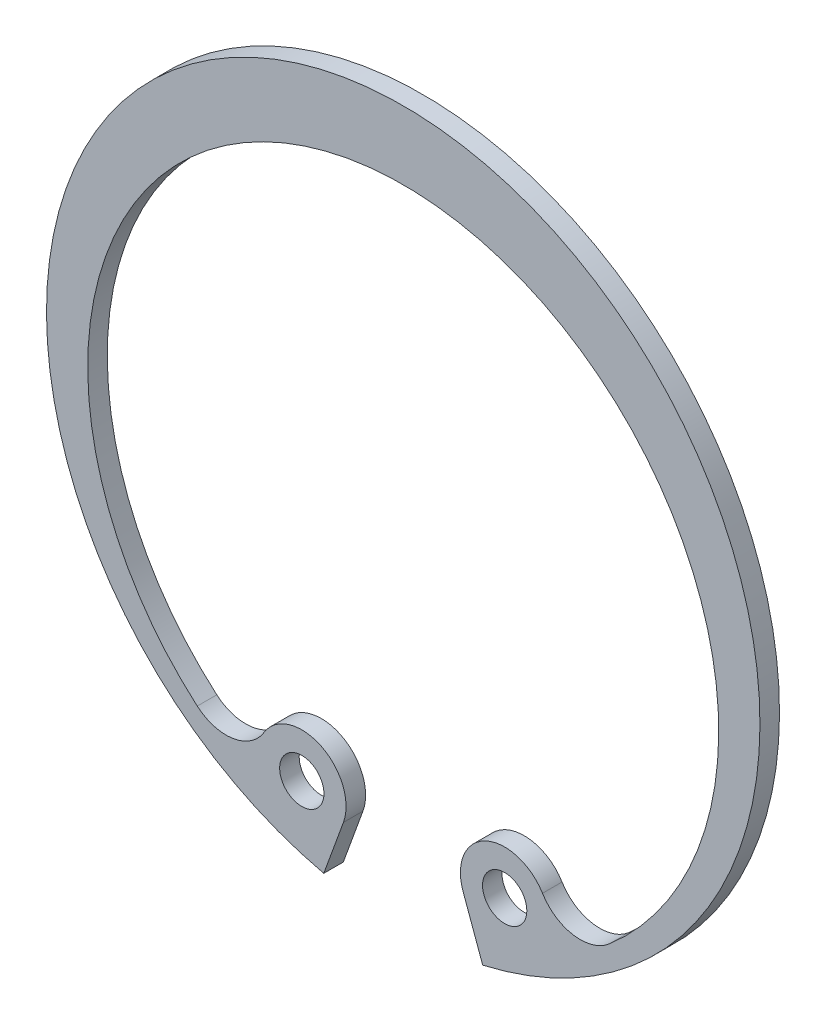
ISO-10303-21;
HEADER;
FILE_DESCRIPTION(('STEP AP214'),'2;1');
FILE_NAME('part.step','',(''),(''),'','','');
FILE_SCHEMA(('AUTOMOTIVE_DESIGN { 1 0 10303 214 1 1 1 1 }'));
ENDSEC;
DATA;
#1=APPLICATION_CONTEXT('core data for automotive mechanical design processes');
#2=APPLICATION_PROTOCOL_DEFINITION('international standard','automotive_design',2000,#1);
#3=PRODUCT_CONTEXT('',#1,'mechanical');
#4=PRODUCT('Part','Part','',(#3));
#5=PRODUCT_RELATED_PRODUCT_CATEGORY('part','',(#4));
#6=PRODUCT_DEFINITION_FORMATION('','',#4);
#7=PRODUCT_DEFINITION_CONTEXT('part definition',#1,'design');
#8=PRODUCT_DEFINITION('design','',#6,#7);
#9=PRODUCT_DEFINITION_SHAPE('','',#8);
#10=(LENGTH_UNIT() NAMED_UNIT(*) SI_UNIT(.MILLI.,.METRE.));
#11=(NAMED_UNIT(*) PLANE_ANGLE_UNIT() SI_UNIT($,.RADIAN.));
#12=(NAMED_UNIT(*) SI_UNIT($,.STERADIAN.) SOLID_ANGLE_UNIT());
#13=UNCERTAINTY_MEASURE_WITH_UNIT(LENGTH_MEASURE(1.E-05),#10,'distance_accuracy_value','');
#14=(GEOMETRIC_REPRESENTATION_CONTEXT(3) GLOBAL_UNCERTAINTY_ASSIGNED_CONTEXT((#13)) GLOBAL_UNIT_ASSIGNED_CONTEXT((#10,
#11,#12)) REPRESENTATION_CONTEXT('',''));
#15=CARTESIAN_POINT('',(0.,0.,0.));
#16=DIRECTION('',(0.,0.,1.));
#17=DIRECTION('',(1.,0.,0.));
#18=AXIS2_PLACEMENT_3D('',#15,#16,#17);
#19=CARTESIAN_POINT('',(0.,0.,1.15));
#20=DIRECTION('',(0.,0.,-1.));
#21=DIRECTION('',(-1.,0.,0.));
#22=AXIS2_PLACEMENT_3D('',#19,#20,#21);
#23=CYLINDRICAL_SURFACE('',#22,21.);
#24=CARTESIAN_POINT('',(0.,0.,1.15));
#25=DIRECTION('',(0.,0.,-1.));
#26=DIRECTION('',(-1.,0.,0.));
#27=AXIS2_PLACEMENT_3D('',#24,#25,#26);
#28=CIRCLE('',#27,21.);
#29=CARTESIAN_POINT('',(-4.67741116916631,-20.4724650385477,1.15));
#30=VERTEX_POINT('',#29);
#31=CARTESIAN_POINT('',(4.67741116916631,-20.4724650385477,1.15));
#32=VERTEX_POINT('',#31);
#33=EDGE_CURVE('E49',#30,#32,#28,.T.);
#34=ORIENTED_EDGE('',*,*,#33,.F.);
#35=DIRECTION('',(0.,0.,-1.));
#36=VECTOR('',#35,1.);
#37=CARTESIAN_POINT('',(-4.67741116916632,-20.4724650385477,2.3));
#38=LINE('',#37,#36);
#39=CARTESIAN_POINT('',(-4.67741116916632,-20.4724650385477,2.3));
#40=VERTEX_POINT('',#39);
#41=EDGE_CURVE('E11',#40,#30,#38,.T.);
#42=ORIENTED_EDGE('',*,*,#41,.F.);
#43=CARTESIAN_POINT('',(0.,0.,2.3));
#44=DIRECTION('',(0.,0.,1.));
#45=DIRECTION('',(1.,0.,0.));
#46=AXIS2_PLACEMENT_3D('',#43,#44,#45);
#47=CIRCLE('',#46,21.);
#48=CARTESIAN_POINT('',(4.67741116916632,-20.4724650385477,2.3));
#49=VERTEX_POINT('',#48);
#50=EDGE_CURVE('E118',#49,#40,#47,.T.);
#51=ORIENTED_EDGE('',*,*,#50,.F.);
#52=DIRECTION('',(0.,0.,-1.));
#53=VECTOR('',#52,1.);
#54=CARTESIAN_POINT('',(4.67741116916632,-20.4724650385477,2.3));
#55=LINE('',#54,#53);
#56=EDGE_CURVE('E111',#49,#32,#55,.T.);
#57=ORIENTED_EDGE('',*,*,#56,.T.);
#58=EDGE_LOOP('',(#34,#42,#51,#57));
#59=FACE_BOUND('',#58,.T.);
#60=ADVANCED_FACE('F33',(#59),#23,.T.);
#61=CARTESIAN_POINT('',(0.,0.,2.3));
#62=DIRECTION('',(0.,0.,1.));
#63=DIRECTION('',(1.,0.,0.));
#64=AXIS2_PLACEMENT_3D('',#61,#62,#63);
#65=PLANE('',#64);
#66=CARTESIAN_POINT('',(5.97172167649896,-16.4071704614486,2.3));
#67=DIRECTION('',(0.,0.,1.));
#68=DIRECTION('',(1.,0.,0.));
#69=AXIS2_PLACEMENT_3D('',#66,#67,#68);
#70=CIRCLE('',#69,1.30333333333333);
#71=CARTESIAN_POINT('',(7.2750550098323,-16.4071704614486,2.3));
#72=VERTEX_POINT('',#71);
#73=EDGE_CURVE('E105',#72,#72,#70,.T.);
#74=ORIENTED_EDGE('',*,*,#73,.F.);
#75=EDGE_LOOP('',(#74));
#76=FACE_BOUND('',#75,.T.);
#77=ORIENTED_EDGE('',*,*,#50,.T.);
#78=DIRECTION('',(0.342020143325669,0.939692620785908,0.));
#79=VECTOR('',#78,1.);
#80=CARTESIAN_POINT('',(-3.52225624498369,-17.2987029683841,2.3));
#81=LINE('',#80,#79);
#82=CARTESIAN_POINT('',(-3.52225624498369,-17.2987029683841,2.3));
#83=VERTEX_POINT('',#82);
#84=EDGE_CURVE('E115',#40,#83,#81,.T.);
#85=ORIENTED_EDGE('',*,*,#84,.T.);
#86=CARTESIAN_POINT('',(-5.97172167649896,-16.4071704614486,2.3));
#87=DIRECTION('',(0.,0.,1.));
#88=DIRECTION('',(1.,0.,0.));
#89=AXIS2_PLACEMENT_3D('',#86,#87,#88);
#90=CIRCLE('',#89,2.60666666666667);
#91=CARTESIAN_POINT('',(-8.19756960205959,-15.0505894194947,2.3));
#92=VERTEX_POINT('',#91);
#93=EDGE_CURVE('E117',#83,#92,#90,.T.);
#94=ORIENTED_EDGE('',*,*,#93,.T.);
#95=CARTESIAN_POINT('',(-10.4234175276202,-13.6940083775409,2.3));
#96=DIRECTION('',(0.,0.,-1.));
#97=DIRECTION('',(1.,0.,0.));
#98=AXIS2_PLACEMENT_3D('',#95,#96,#97);
#99=CIRCLE('',#98,2.60666666666667);
#100=CARTESIAN_POINT('',(-12.1251999811092,-15.6685077044863,2.3));
#101=VERTEX_POINT('',#100);
#102=EDGE_CURVE('E130',#92,#101,#99,.T.);
#103=ORIENTED_EDGE('',*,*,#102,.T.);
#104=CARTESIAN_POINT('',(0.,-1.6002,2.3));
#105=DIRECTION('',(0.,0.,-1.));
#106=DIRECTION('',(1.,0.,0.));
#107=AXIS2_PLACEMENT_3D('',#104,#105,#106);
#108=CIRCLE('',#107,18.5725);
#109=CARTESIAN_POINT('',(12.1251999811092,-15.6685077044863,2.3));
#110=VERTEX_POINT('',#109);
#111=EDGE_CURVE('E132',#101,#110,#108,.T.);
#112=ORIENTED_EDGE('',*,*,#111,.T.);
#113=CARTESIAN_POINT('',(10.4234175276202,-13.6940083775409,2.3));
#114=DIRECTION('',(0.,0.,-1.));
#115=DIRECTION('',(-1.,0.,0.));
#116=AXIS2_PLACEMENT_3D('',#113,#114,#115);
#117=CIRCLE('',#116,2.60666666666667);
#118=CARTESIAN_POINT('',(8.19756960205958,-15.0505894194947,2.3));
#119=VERTEX_POINT('',#118);
#120=EDGE_CURVE('E134',#110,#119,#117,.T.);
#121=ORIENTED_EDGE('',*,*,#120,.T.);
#122=CARTESIAN_POINT('',(5.97172167649896,-16.4071704614486,2.3));
#123=DIRECTION('',(0.,0.,1.));
#124=DIRECTION('',(-1.,0.,0.));
#125=AXIS2_PLACEMENT_3D('',#122,#123,#124);
#126=CIRCLE('',#125,2.60666666666667);
#127=CARTESIAN_POINT('',(3.52225624498369,-17.2987029683841,2.3));
#128=VERTEX_POINT('',#127);
#129=EDGE_CURVE('E136',#119,#128,#126,.T.);
#130=ORIENTED_EDGE('',*,*,#129,.T.);
#131=DIRECTION('',(0.342020143325669,-0.939692620785908,0.));
#132=VECTOR('',#131,1.);
#133=CARTESIAN_POINT('',(3.52225624498369,-17.2987029683841,2.3));
#134=LINE('',#133,#132);
#135=EDGE_CURVE('E57',#128,#49,#134,.T.);
#136=ORIENTED_EDGE('',*,*,#135,.T.);
#137=EDGE_LOOP('',(#77,#85,#94,#103,#112,#121,#130,#136));
#138=FACE_BOUND('',#137,.T.);
#139=CARTESIAN_POINT('',(-5.97172167649896,-16.4071704614486,2.3));
#140=DIRECTION('',(0.,0.,1.));
#141=DIRECTION('',(1.,0.,0.));
#142=AXIS2_PLACEMENT_3D('',#139,#140,#141);
#143=CIRCLE('',#142,1.30333333333333);
#144=CARTESIAN_POINT('',(-4.66838834316563,-16.4071704614486,2.3));
#145=VERTEX_POINT('',#144);
#146=EDGE_CURVE('E229',#145,#145,#143,.T.);
#147=ORIENTED_EDGE('',*,*,#146,.F.);
#148=EDGE_LOOP('',(#147));
#149=FACE_BOUND('',#148,.T.);
#150=ADVANCED_FACE('F120',(#76,#138,#149),#65,.T.);
#151=CARTESIAN_POINT('',(-3.52225624498369,-17.2987029683841,2.3));
#152=DIRECTION('',(-0.939692620785908,0.342020143325669,0.));
#153=DIRECTION('',(-0.342020143325669,-0.939692620785908,0.));
#154=AXIS2_PLACEMENT_3D('',#151,#152,#153);
#155=PLANE('',#154);
#156=DIRECTION('',(0.342020143325669,0.939692620785908,0.));
#157=VECTOR('',#156,1.);
#158=CARTESIAN_POINT('',(-3.52225624498369,-17.2987029683841,1.15));
#159=LINE('',#158,#157);
#160=CARTESIAN_POINT('',(-3.52225624498369,-17.2987029683841,1.15));
#161=VERTEX_POINT('',#160);
#162=EDGE_CURVE('E98',#30,#161,#159,.T.);
#163=ORIENTED_EDGE('',*,*,#162,.T.);
#164=DIRECTION('',(0.,0.,-1.));
#165=VECTOR('',#164,1.);
#166=CARTESIAN_POINT('',(-3.52225624498369,-17.2987029683841,2.3));
#167=LINE('',#166,#165);
#168=EDGE_CURVE('E41',#83,#161,#167,.T.);
#169=ORIENTED_EDGE('',*,*,#168,.F.);
#170=ORIENTED_EDGE('',*,*,#84,.F.);
#171=ORIENTED_EDGE('',*,*,#41,.T.);
#172=EDGE_LOOP('',(#163,#169,#170,#171));
#173=FACE_BOUND('',#172,.T.);
#174=ADVANCED_FACE('F114',(#173),#155,.F.);
#175=CARTESIAN_POINT('',(-5.97172167649896,-16.4071704614486,2.3));
#176=DIRECTION('',(0.,0.,-1.));
#177=DIRECTION('',(-1.,0.,0.));
#178=AXIS2_PLACEMENT_3D('',#175,#176,#177);
#179=CYLINDRICAL_SURFACE('',#178,2.60666666666667);
#180=CARTESIAN_POINT('',(-5.97172167649896,-16.4071704614486,1.15));
#181=DIRECTION('',(0.,0.,1.));
#182=DIRECTION('',(1.,0.,0.));
#183=AXIS2_PLACEMENT_3D('',#180,#181,#182);
#184=CIRCLE('',#183,2.60666666666667);
#185=CARTESIAN_POINT('',(-8.19756960205959,-15.0505894194947,1.15));
#186=VERTEX_POINT('',#185);
#187=EDGE_CURVE('E101',#161,#186,#184,.T.);
#188=ORIENTED_EDGE('',*,*,#187,.T.);
#189=DIRECTION('',(0.,0.,-1.));
#190=VECTOR('',#189,1.);
#191=CARTESIAN_POINT('',(-8.19756960205959,-15.0505894194947,2.3));
#192=LINE('',#191,#190);
#193=EDGE_CURVE('E172',#92,#186,#192,.T.);
#194=ORIENTED_EDGE('',*,*,#193,.F.);
#195=ORIENTED_EDGE('',*,*,#93,.F.);
#196=ORIENTED_EDGE('',*,*,#168,.T.);
#197=EDGE_LOOP('',(#188,#194,#195,#196));
#198=FACE_BOUND('',#197,.T.);
#199=ADVANCED_FACE('F178',(#198),#179,.T.);
#200=CARTESIAN_POINT('',(-10.4234175276202,-13.6940083775409,2.3));
#201=DIRECTION('',(0.,0.,-1.));
#202=DIRECTION('',(-1.,0.,0.));
#203=AXIS2_PLACEMENT_3D('',#200,#201,#202);
#204=CYLINDRICAL_SURFACE('',#203,2.60666666666667);
#205=CARTESIAN_POINT('',(-10.4234175276202,-13.6940083775409,1.15));
#206=DIRECTION('',(0.,0.,-1.));
#207=DIRECTION('',(1.,0.,0.));
#208=AXIS2_PLACEMENT_3D('',#205,#206,#207);
#209=CIRCLE('',#208,2.60666666666667);
#210=CARTESIAN_POINT('',(-12.1251999811092,-15.6685077044863,1.15));
#211=VERTEX_POINT('',#210);
#212=EDGE_CURVE('E140',#186,#211,#209,.T.);
#213=ORIENTED_EDGE('',*,*,#212,.T.);
#214=DIRECTION('',(0.,0.,-1.));
#215=VECTOR('',#214,1.);
#216=CARTESIAN_POINT('',(-12.1251999811092,-15.6685077044863,2.3));
#217=LINE('',#216,#215);
#218=EDGE_CURVE('E167',#101,#211,#217,.T.);
#219=ORIENTED_EDGE('',*,*,#218,.F.);
#220=ORIENTED_EDGE('',*,*,#102,.F.);
#221=ORIENTED_EDGE('',*,*,#193,.T.);
#222=EDGE_LOOP('',(#213,#219,#220,#221));
#223=FACE_BOUND('',#222,.T.);
#224=ADVANCED_FACE('F185',(#223),#204,.F.);
#225=CARTESIAN_POINT('',(0.,-1.6002,2.3));
#226=DIRECTION('',(0.,0.,-1.));
#227=DIRECTION('',(-1.,0.,0.));
#228=AXIS2_PLACEMENT_3D('',#225,#226,#227);
#229=CYLINDRICAL_SURFACE('',#228,18.5725);
#230=CARTESIAN_POINT('',(0.,-1.6002,1.15));
#231=DIRECTION('',(0.,0.,-1.));
#232=DIRECTION('',(1.,0.,0.));
#233=AXIS2_PLACEMENT_3D('',#230,#231,#232);
#234=CIRCLE('',#233,18.5725);
#235=CARTESIAN_POINT('',(12.1251999811092,-15.6685077044863,1.15));
#236=VERTEX_POINT('',#235);
#237=EDGE_CURVE('E143',#211,#236,#234,.T.);
#238=ORIENTED_EDGE('',*,*,#237,.T.);
#239=DIRECTION('',(0.,0.,-1.));
#240=VECTOR('',#239,1.);
#241=CARTESIAN_POINT('',(12.1251999811092,-15.6685077044863,2.3));
#242=LINE('',#241,#240);
#243=EDGE_CURVE('E162',#110,#236,#242,.T.);
#244=ORIENTED_EDGE('',*,*,#243,.F.);
#245=ORIENTED_EDGE('',*,*,#111,.F.);
#246=ORIENTED_EDGE('',*,*,#218,.T.);
#247=EDGE_LOOP('',(#238,#244,#245,#246));
#248=FACE_BOUND('',#247,.T.);
#249=ADVANCED_FACE('F187',(#248),#229,.F.);
#250=CARTESIAN_POINT('',(10.4234175276202,-13.6940083775409,2.3));
#251=DIRECTION('',(0.,0.,-1.));
#252=DIRECTION('',(-1.,0.,0.));
#253=AXIS2_PLACEMENT_3D('',#250,#251,#252);
#254=CYLINDRICAL_SURFACE('',#253,2.60666666666667);
#255=CARTESIAN_POINT('',(10.4234175276202,-13.6940083775409,1.15));
#256=DIRECTION('',(0.,0.,-1.));
#257=DIRECTION('',(-1.,0.,0.));
#258=AXIS2_PLACEMENT_3D('',#255,#256,#257);
#259=CIRCLE('',#258,2.60666666666667);
#260=CARTESIAN_POINT('',(8.19756960205958,-15.0505894194947,1.15));
#261=VERTEX_POINT('',#260);
#262=EDGE_CURVE('E146',#236,#261,#259,.T.);
#263=ORIENTED_EDGE('',*,*,#262,.T.);
#264=DIRECTION('',(0.,0.,-1.));
#265=VECTOR('',#264,1.);
#266=CARTESIAN_POINT('',(8.19756960205958,-15.0505894194947,2.3));
#267=LINE('',#266,#265);
#268=EDGE_CURVE('E158',#119,#261,#267,.T.);
#269=ORIENTED_EDGE('',*,*,#268,.F.);
#270=ORIENTED_EDGE('',*,*,#120,.F.);
#271=ORIENTED_EDGE('',*,*,#243,.T.);
#272=EDGE_LOOP('',(#263,#269,#270,#271));
#273=FACE_BOUND('',#272,.T.);
#274=ADVANCED_FACE('F190',(#273),#254,.F.);
#275=CARTESIAN_POINT('',(5.97172167649896,-16.4071704614486,2.3));
#276=DIRECTION('',(0.,0.,-1.));
#277=DIRECTION('',(-1.,0.,0.));
#278=AXIS2_PLACEMENT_3D('',#275,#276,#277);
#279=CYLINDRICAL_SURFACE('',#278,2.60666666666667);
#280=CARTESIAN_POINT('',(5.97172167649896,-16.4071704614486,1.15));
#281=DIRECTION('',(0.,0.,1.));
#282=DIRECTION('',(-1.,0.,0.));
#283=AXIS2_PLACEMENT_3D('',#280,#281,#282);
#284=CIRCLE('',#283,2.60666666666667);
#285=CARTESIAN_POINT('',(3.52225624498369,-17.2987029683841,1.15));
#286=VERTEX_POINT('',#285);
#287=EDGE_CURVE('E124',#261,#286,#284,.T.);
#288=ORIENTED_EDGE('',*,*,#287,.T.);
#289=DIRECTION('',(0.,0.,-1.));
#290=VECTOR('',#289,1.);
#291=CARTESIAN_POINT('',(3.52225624498369,-17.2987029683841,2.3));
#292=LINE('',#291,#290);
#293=EDGE_CURVE('E153',#128,#286,#292,.T.);
#294=ORIENTED_EDGE('',*,*,#293,.F.);
#295=ORIENTED_EDGE('',*,*,#129,.F.);
#296=ORIENTED_EDGE('',*,*,#268,.T.);
#297=EDGE_LOOP('',(#288,#294,#295,#296));
#298=FACE_BOUND('',#297,.T.);
#299=ADVANCED_FACE('F191',(#298),#279,.T.);
#300=CARTESIAN_POINT('',(3.52225624498369,-17.2987029683841,2.3));
#301=DIRECTION('',(0.939692620785908,0.342020143325669,0.));
#302=DIRECTION('',(-0.342020143325669,0.939692620785908,0.));
#303=AXIS2_PLACEMENT_3D('',#300,#301,#302);
#304=PLANE('',#303);
#305=DIRECTION('',(0.342020143325669,-0.939692620785908,0.));
#306=VECTOR('',#305,1.);
#307=CARTESIAN_POINT('',(3.52225624498369,-17.2987029683841,1.15));
#308=LINE('',#307,#306);
#309=EDGE_CURVE('E122',#286,#32,#308,.T.);
#310=ORIENTED_EDGE('',*,*,#309,.T.);
#311=ORIENTED_EDGE('',*,*,#56,.F.);
#312=ORIENTED_EDGE('',*,*,#135,.F.);
#313=ORIENTED_EDGE('',*,*,#293,.T.);
#314=EDGE_LOOP('',(#310,#311,#312,#313));
#315=FACE_BOUND('',#314,.T.);
#316=ADVANCED_FACE('F192',(#315),#304,.F.);
#317=CARTESIAN_POINT('',(5.97172167649896,-16.4071704614486,2.3));
#318=DIRECTION('',(0.,0.,-1.));
#319=DIRECTION('',(-1.,0.,0.));
#320=AXIS2_PLACEMENT_3D('',#317,#318,#319);
#321=CYLINDRICAL_SURFACE('',#320,1.30333333333333);
#322=ORIENTED_EDGE('',*,*,#73,.T.);
#323=EDGE_LOOP('',(#322));
#324=FACE_BOUND('',#323,.T.);
#325=CARTESIAN_POINT('',(5.97172167649896,-16.4071704614486,1.15));
#326=DIRECTION('',(0.,0.,-1.));
#327=DIRECTION('',(-1.,0.,0.));
#328=AXIS2_PLACEMENT_3D('',#325,#326,#327);
#329=CIRCLE('',#328,1.30333333333333);
#330=CARTESIAN_POINT('',(4.66838834316563,-16.4071704614486,1.15));
#331=VERTEX_POINT('',#330);
#332=EDGE_CURVE('E227',#331,#331,#329,.T.);
#333=ORIENTED_EDGE('',*,*,#332,.T.);
#334=EDGE_LOOP('',(#333));
#335=FACE_BOUND('',#334,.T.);
#336=ADVANCED_FACE('F194',(#324,#335),#321,.F.);
#337=CARTESIAN_POINT('',(-5.97172167649896,-16.4071704614486,2.3));
#338=DIRECTION('',(0.,0.,-1.));
#339=DIRECTION('',(-1.,0.,0.));
#340=AXIS2_PLACEMENT_3D('',#337,#338,#339);
#341=CYLINDRICAL_SURFACE('',#340,1.30333333333333);
#342=ORIENTED_EDGE('',*,*,#146,.T.);
#343=EDGE_LOOP('',(#342));
#344=FACE_BOUND('',#343,.T.);
#345=CARTESIAN_POINT('',(-5.97172167649896,-16.4071704614486,1.15));
#346=DIRECTION('',(0.,0.,-1.));
#347=DIRECTION('',(-1.,0.,0.));
#348=AXIS2_PLACEMENT_3D('',#345,#346,#347);
#349=CIRCLE('',#348,1.30333333333333);
#350=CARTESIAN_POINT('',(-7.2750550098323,-16.4071704614486,1.15));
#351=VERTEX_POINT('',#350);
#352=EDGE_CURVE('E112',#351,#351,#349,.T.);
#353=ORIENTED_EDGE('',*,*,#352,.T.);
#354=EDGE_LOOP('',(#353));
#355=FACE_BOUND('',#354,.T.);
#356=ADVANCED_FACE('F200',(#344,#355),#341,.F.);
#357=CARTESIAN_POINT('',(0.,0.,1.15));
#358=DIRECTION('',(0.,0.,-1.));
#359=DIRECTION('',(-1.,0.,0.));
#360=AXIS2_PLACEMENT_3D('',#357,#358,#359);
#361=PLANE('',#360);
#362=ORIENTED_EDGE('',*,*,#352,.F.);
#363=EDGE_LOOP('',(#362));
#364=FACE_BOUND('',#363,.T.);
#365=ORIENTED_EDGE('',*,*,#332,.F.);
#366=EDGE_LOOP('',(#365));
#367=FACE_BOUND('',#366,.T.);
#368=ORIENTED_EDGE('',*,*,#162,.F.);
#369=ORIENTED_EDGE('',*,*,#33,.T.);
#370=ORIENTED_EDGE('',*,*,#309,.F.);
#371=ORIENTED_EDGE('',*,*,#287,.F.);
#372=ORIENTED_EDGE('',*,*,#262,.F.);
#373=ORIENTED_EDGE('',*,*,#237,.F.);
#374=ORIENTED_EDGE('',*,*,#212,.F.);
#375=ORIENTED_EDGE('',*,*,#187,.F.);
#376=EDGE_LOOP('',(#368,#369,#370,#371,#372,#373,#374,#375));
#377=FACE_BOUND('',#376,.T.);
#378=ADVANCED_FACE('F99',(#364,#367,#377),#361,.T.);
#379=CLOSED_SHELL('',(#60,#150,#174,#199,#224,#249,#274,#299,#316,#336,#356,#378));
#380=MANIFOLD_SOLID_BREP('B2',#379);
#381=ADVANCED_BREP_SHAPE_REPRESENTATION('',(#18,#380),#14);
#382=SHAPE_DEFINITION_REPRESENTATION(#9,#381);
ENDSEC;
END-ISO-10303-21;
